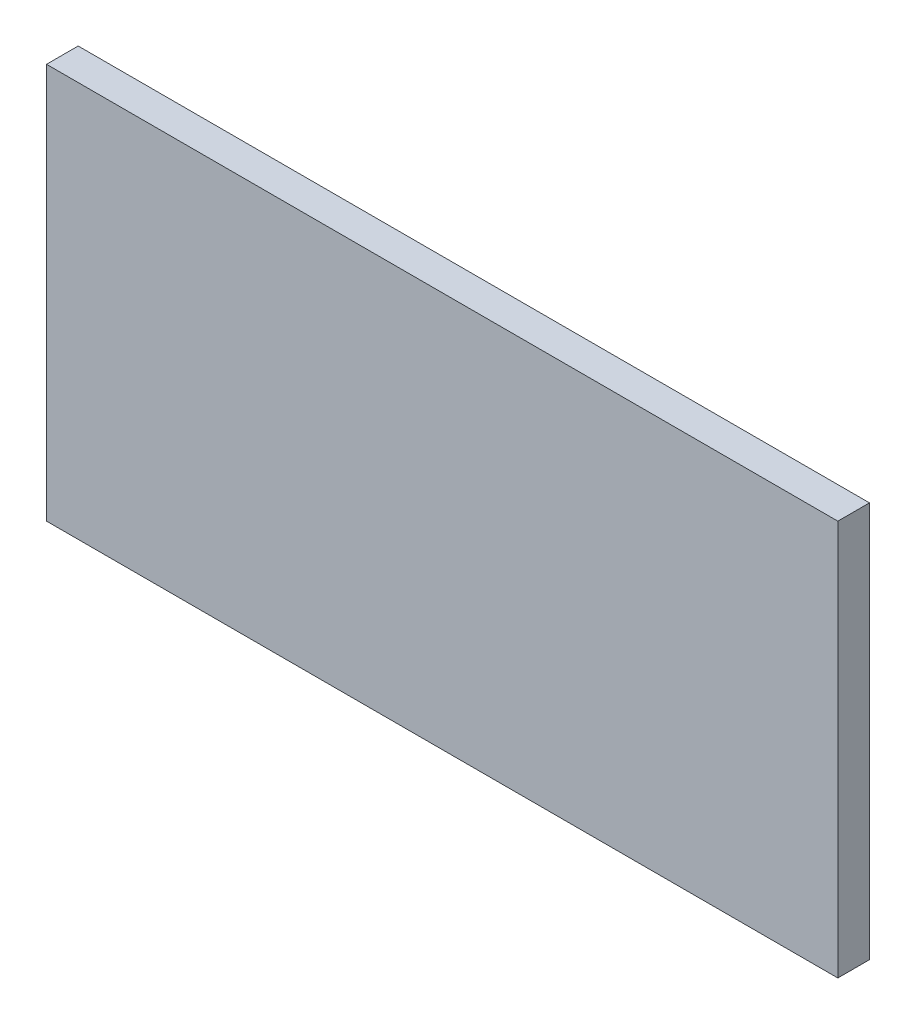
ISO-10303-21;
HEADER;
FILE_DESCRIPTION(('STEP AP214'),'2;1');
FILE_NAME('part.step','',(''),(''),'','','');
FILE_SCHEMA(('AUTOMOTIVE_DESIGN { 1 0 10303 214 1 1 1 1 }'));
ENDSEC;
DATA;
#1=APPLICATION_CONTEXT('core data for automotive mechanical design processes');
#2=APPLICATION_PROTOCOL_DEFINITION('international standard','automotive_design',2000,#1);
#3=PRODUCT_CONTEXT('',#1,'mechanical');
#4=PRODUCT('Part','Part','',(#3));
#5=PRODUCT_RELATED_PRODUCT_CATEGORY('part','',(#4));
#6=PRODUCT_DEFINITION_FORMATION('','',#4);
#7=PRODUCT_DEFINITION_CONTEXT('part definition',#1,'design');
#8=PRODUCT_DEFINITION('design','',#6,#7);
#9=PRODUCT_DEFINITION_SHAPE('','',#8);
#10=(LENGTH_UNIT() NAMED_UNIT(*) SI_UNIT(.MILLI.,.METRE.));
#11=(NAMED_UNIT(*) PLANE_ANGLE_UNIT() SI_UNIT($,.RADIAN.));
#12=(NAMED_UNIT(*) SI_UNIT($,.STERADIAN.) SOLID_ANGLE_UNIT());
#13=UNCERTAINTY_MEASURE_WITH_UNIT(LENGTH_MEASURE(1.E-05),#10,'distance_accuracy_value','');
#14=(GEOMETRIC_REPRESENTATION_CONTEXT(3) GLOBAL_UNCERTAINTY_ASSIGNED_CONTEXT((#13)) GLOBAL_UNIT_ASSIGNED_CONTEXT((#10,
#11,#12)) REPRESENTATION_CONTEXT('',''));
#15=CARTESIAN_POINT('',(0.,0.,0.));
#16=DIRECTION('',(0.,0.,1.));
#17=DIRECTION('',(1.,0.,0.));
#18=AXIS2_PLACEMENT_3D('',#15,#16,#17);
#19=CARTESIAN_POINT('',(-5.56506849315066,30.0895414356924,2.));
#20=DIRECTION('',(-1.,0.,0.));
#21=DIRECTION('',(0.,0.,1.));
#22=AXIS2_PLACEMENT_3D('',#19,#20,#21);
#23=PLANE('',#22);
#24=DIRECTION('',(0.,1.,0.));
#25=VECTOR('',#24,1.);
#26=CARTESIAN_POINT('',(-5.56506849315066,30.0895414356924,0.));
#27=LINE('',#26,#25);
#28=CARTESIAN_POINT('',(-5.56506849315066,5.08954143569237,0.));
#29=VERTEX_POINT('',#28);
#30=CARTESIAN_POINT('',(-5.56506849315066,30.0895414356924,0.));
#31=VERTEX_POINT('',#30);
#32=EDGE_CURVE('E111',#29,#31,#27,.T.);
#33=ORIENTED_EDGE('',*,*,#32,.T.);
#34=DIRECTION('',(0.,0.,-1.));
#35=VECTOR('',#34,1.);
#36=CARTESIAN_POINT('',(-5.56506849315066,30.0895414356924,2.));
#37=LINE('',#36,#35);
#38=CARTESIAN_POINT('',(-5.56506849315066,30.0895414356924,2.));
#39=VERTEX_POINT('',#38);
#40=EDGE_CURVE('E11',#39,#31,#37,.T.);
#41=ORIENTED_EDGE('',*,*,#40,.F.);
#42=DIRECTION('',(0.,1.,0.));
#43=VECTOR('',#42,1.);
#44=CARTESIAN_POINT('',(-5.56506849315066,30.0895414356924,2.));
#45=LINE('',#44,#43);
#46=CARTESIAN_POINT('',(-5.56506849315066,5.08954143569237,2.));
#47=VERTEX_POINT('',#46);
#48=EDGE_CURVE('E95',#47,#39,#45,.T.);
#49=ORIENTED_EDGE('',*,*,#48,.F.);
#50=DIRECTION('',(0.,0.,-1.));
#51=VECTOR('',#50,1.);
#52=CARTESIAN_POINT('',(-5.56506849315066,5.08954143569237,2.));
#53=LINE('',#52,#51);
#54=EDGE_CURVE('E107',#47,#29,#53,.T.);
#55=ORIENTED_EDGE('',*,*,#54,.T.);
#56=EDGE_LOOP('',(#33,#41,#49,#55));
#57=FACE_BOUND('',#56,.T.);
#58=ADVANCED_FACE('F43',(#57),#23,.F.);
#59=CARTESIAN_POINT('',(-55.5650684931507,30.0895414356924,2.));
#60=DIRECTION('',(0.,-1.,0.));
#61=DIRECTION('',(0.,0.,-1.));
#62=AXIS2_PLACEMENT_3D('',#59,#60,#61);
#63=PLANE('',#62);
#64=DIRECTION('',(-1.,0.,0.));
#65=VECTOR('',#64,1.);
#66=CARTESIAN_POINT('',(-55.5650684931507,30.0895414356924,0.));
#67=LINE('',#66,#65);
#68=CARTESIAN_POINT('',(-55.5650684931507,30.0895414356924,0.));
#69=VERTEX_POINT('',#68);
#70=EDGE_CURVE('E100',#31,#69,#67,.T.);
#71=ORIENTED_EDGE('',*,*,#70,.T.);
#72=DIRECTION('',(0.,0.,-1.));
#73=VECTOR('',#72,1.);
#74=CARTESIAN_POINT('',(-55.5650684931507,30.0895414356924,2.));
#75=LINE('',#74,#73);
#76=CARTESIAN_POINT('',(-55.5650684931507,30.0895414356924,2.));
#77=VERTEX_POINT('',#76);
#78=EDGE_CURVE('E52',#77,#69,#75,.T.);
#79=ORIENTED_EDGE('',*,*,#78,.F.);
#80=DIRECTION('',(-1.,0.,0.));
#81=VECTOR('',#80,1.);
#82=CARTESIAN_POINT('',(-55.5650684931507,30.0895414356924,2.));
#83=LINE('',#82,#81);
#84=EDGE_CURVE('E90',#39,#77,#83,.T.);
#85=ORIENTED_EDGE('',*,*,#84,.F.);
#86=ORIENTED_EDGE('',*,*,#40,.T.);
#87=EDGE_LOOP('',(#71,#79,#85,#86));
#88=FACE_BOUND('',#87,.T.);
#89=ADVANCED_FACE('F99',(#88),#63,.F.);
#90=CARTESIAN_POINT('',(-55.5650684931507,30.0895414356924,2.));
#91=DIRECTION('',(1.,0.,0.));
#92=DIRECTION('',(0.,1.,0.));
#93=AXIS2_PLACEMENT_3D('',#90,#91,#92);
#94=PLANE('',#93);
#95=DIRECTION('',(0.,-1.,0.));
#96=VECTOR('',#95,1.);
#97=CARTESIAN_POINT('',(-55.5650684931507,30.0895414356924,0.));
#98=LINE('',#97,#96);
#99=CARTESIAN_POINT('',(-55.5650684931507,5.08954143569237,0.));
#100=VERTEX_POINT('',#99);
#101=EDGE_CURVE('E77',#69,#100,#98,.T.);
#102=ORIENTED_EDGE('',*,*,#101,.T.);
#103=DIRECTION('',(0.,0.,-1.));
#104=VECTOR('',#103,1.);
#105=CARTESIAN_POINT('',(-55.5650684931507,5.08954143569237,2.));
#106=LINE('',#105,#104);
#107=CARTESIAN_POINT('',(-55.5650684931507,5.08954143569237,2.));
#108=VERTEX_POINT('',#107);
#109=EDGE_CURVE('E102',#108,#100,#106,.T.);
#110=ORIENTED_EDGE('',*,*,#109,.F.);
#111=DIRECTION('',(0.,-1.,0.));
#112=VECTOR('',#111,1.);
#113=CARTESIAN_POINT('',(-55.5650684931507,30.0895414356924,2.));
#114=LINE('',#113,#112);
#115=EDGE_CURVE('E93',#77,#108,#114,.T.);
#116=ORIENTED_EDGE('',*,*,#115,.F.);
#117=ORIENTED_EDGE('',*,*,#78,.T.);
#118=EDGE_LOOP('',(#102,#110,#116,#117));
#119=FACE_BOUND('',#118,.T.);
#120=ADVANCED_FACE('F103',(#119),#94,.F.);
#121=CARTESIAN_POINT('',(-55.5650684931507,5.08954143569237,2.));
#122=DIRECTION('',(0.,1.,0.));
#123=DIRECTION('',(0.,0.,1.));
#124=AXIS2_PLACEMENT_3D('',#121,#122,#123);
#125=PLANE('',#124);
#126=DIRECTION('',(1.,0.,0.));
#127=VECTOR('',#126,1.);
#128=CARTESIAN_POINT('',(-55.5650684931507,5.08954143569237,0.));
#129=LINE('',#128,#127);
#130=EDGE_CURVE('E83',#100,#29,#129,.T.);
#131=ORIENTED_EDGE('',*,*,#130,.T.);
#132=ORIENTED_EDGE('',*,*,#54,.F.);
#133=DIRECTION('',(1.,0.,0.));
#134=VECTOR('',#133,1.);
#135=CARTESIAN_POINT('',(-55.5650684931507,5.08954143569237,2.));
#136=LINE('',#135,#134);
#137=EDGE_CURVE('E60',#108,#47,#136,.T.);
#138=ORIENTED_EDGE('',*,*,#137,.F.);
#139=ORIENTED_EDGE('',*,*,#109,.T.);
#140=EDGE_LOOP('',(#131,#132,#138,#139));
#141=FACE_BOUND('',#140,.T.);
#142=ADVANCED_FACE('F124',(#141),#125,.F.);
#143=CARTESIAN_POINT('',(0.,0.,2.));
#144=DIRECTION('',(0.,0.,1.));
#145=DIRECTION('',(1.,0.,0.));
#146=AXIS2_PLACEMENT_3D('',#143,#144,#145);
#147=PLANE('',#146);
#148=ORIENTED_EDGE('',*,*,#48,.T.);
#149=ORIENTED_EDGE('',*,*,#84,.T.);
#150=ORIENTED_EDGE('',*,*,#115,.T.);
#151=ORIENTED_EDGE('',*,*,#137,.T.);
#152=EDGE_LOOP('',(#148,#149,#150,#151));
#153=FACE_BOUND('',#152,.T.);
#154=ADVANCED_FACE('F91',(#153),#147,.T.);
#155=CARTESIAN_POINT('',(0.,0.,0.));
#156=DIRECTION('',(0.,0.,1.));
#157=DIRECTION('',(1.,0.,0.));
#158=AXIS2_PLACEMENT_3D('',#155,#156,#157);
#159=PLANE('',#158);
#160=ORIENTED_EDGE('',*,*,#32,.F.);
#161=ORIENTED_EDGE('',*,*,#130,.F.);
#162=ORIENTED_EDGE('',*,*,#101,.F.);
#163=ORIENTED_EDGE('',*,*,#70,.F.);
#164=EDGE_LOOP('',(#160,#161,#162,#163));
#165=FACE_BOUND('',#164,.T.);
#166=ADVANCED_FACE('F127',(#165),#159,.F.);
#167=CLOSED_SHELL('',(#58,#89,#120,#142,#154,#166));
#168=MANIFOLD_SOLID_BREP('B2',#167);
#169=ADVANCED_BREP_SHAPE_REPRESENTATION('',(#18,#168),#14);
#170=SHAPE_DEFINITION_REPRESENTATION(#9,#169);
ENDSEC;
END-ISO-10303-21;
